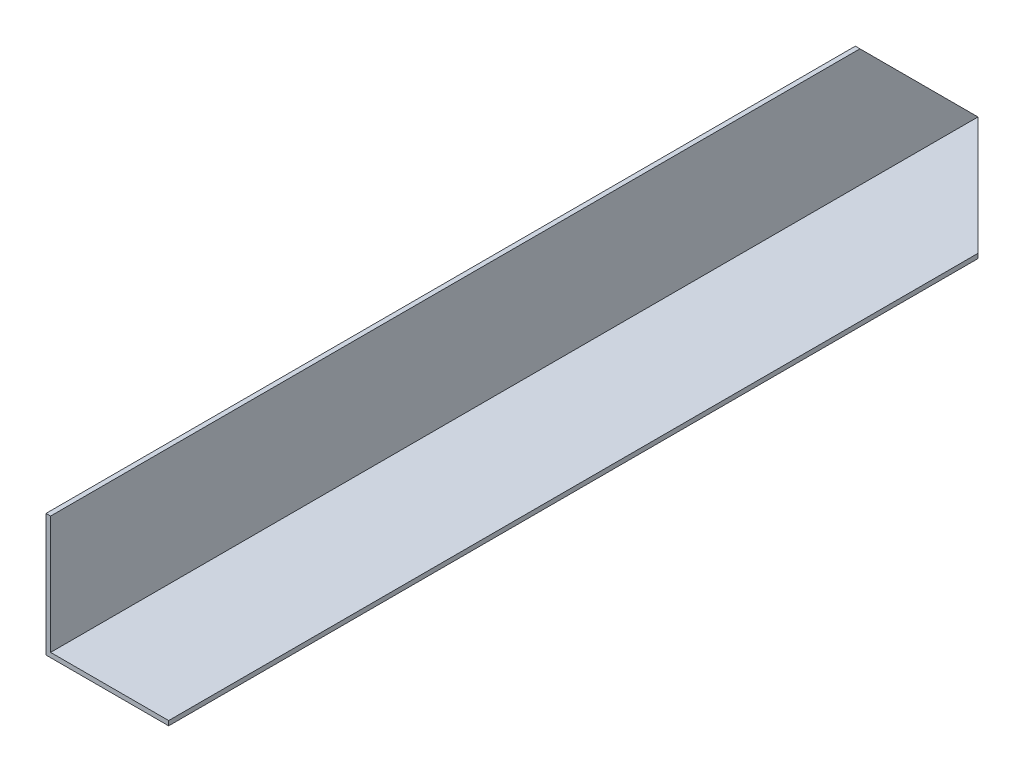
ISO-10303-21;
HEADER;
FILE_DESCRIPTION(('STEP AP214'),'2;1');
FILE_NAME('part.step','',(''),(''),'','','');
FILE_SCHEMA(('AUTOMOTIVE_DESIGN { 1 0 10303 214 1 1 1 1 }'));
ENDSEC;
DATA;
#1=APPLICATION_CONTEXT('core data for automotive mechanical design processes');
#2=APPLICATION_PROTOCOL_DEFINITION('international standard','automotive_design',2000,#1);
#3=PRODUCT_CONTEXT('',#1,'mechanical');
#4=PRODUCT('Part','Part','',(#3));
#5=PRODUCT_RELATED_PRODUCT_CATEGORY('part','',(#4));
#6=PRODUCT_DEFINITION_FORMATION('','',#4);
#7=PRODUCT_DEFINITION_CONTEXT('part definition',#1,'design');
#8=PRODUCT_DEFINITION('design','',#6,#7);
#9=PRODUCT_DEFINITION_SHAPE('','',#8);
#10=(LENGTH_UNIT() NAMED_UNIT(*) SI_UNIT(.MILLI.,.METRE.));
#11=(NAMED_UNIT(*) PLANE_ANGLE_UNIT() SI_UNIT($,.RADIAN.));
#12=(NAMED_UNIT(*) SI_UNIT($,.STERADIAN.) SOLID_ANGLE_UNIT());
#13=UNCERTAINTY_MEASURE_WITH_UNIT(LENGTH_MEASURE(1.E-05),#10,'distance_accuracy_value','');
#14=(GEOMETRIC_REPRESENTATION_CONTEXT(3) GLOBAL_UNCERTAINTY_ASSIGNED_CONTEXT((#13)) GLOBAL_UNIT_ASSIGNED_CONTEXT((#10,
#11,#12)) REPRESENTATION_CONTEXT('',''));
#15=CARTESIAN_POINT('',(0.,0.,0.));
#16=DIRECTION('',(0.,0.,1.));
#17=DIRECTION('',(1.,0.,0.));
#18=AXIS2_PLACEMENT_3D('',#15,#16,#17);
#19=CARTESIAN_POINT('',(0.,0.,300.));
#20=DIRECTION('',(0.,0.,1.));
#21=DIRECTION('',(1.,0.,0.));
#22=AXIS2_PLACEMENT_3D('',#19,#20,#21);
#23=PLANE('',#22);
#24=DIRECTION('',(0.,-1.,0.));
#25=VECTOR('',#24,1.);
#26=CARTESIAN_POINT('',(-461.5,-501.5,300.));
#27=LINE('',#26,#25);
#28=CARTESIAN_POINT('',(-461.5,-500.,300.));
#29=VERTEX_POINT('',#28);
#30=CARTESIAN_POINT('',(-461.5,-501.5,300.));
#31=VERTEX_POINT('',#30);
#32=EDGE_CURVE('E133',#29,#31,#27,.T.);
#33=ORIENTED_EDGE('',*,*,#32,.F.);
#34=DIRECTION('',(1.,0.,0.));
#35=VECTOR('',#34,1.);
#36=CARTESIAN_POINT('',(-461.5,-500.,300.));
#37=LINE('',#36,#35);
#38=CARTESIAN_POINT('',(-500.,-500.,300.));
#39=VERTEX_POINT('',#38);
#40=EDGE_CURVE('E123',#39,#29,#37,.T.);
#41=ORIENTED_EDGE('',*,*,#40,.F.);
#42=DIRECTION('',(0.,-1.,0.));
#43=VECTOR('',#42,1.);
#44=CARTESIAN_POINT('',(-500.,-500.,300.));
#45=LINE('',#44,#43);
#46=CARTESIAN_POINT('',(-500.,-461.5,300.));
#47=VERTEX_POINT('',#46);
#48=EDGE_CURVE('E125',#47,#39,#45,.T.);
#49=ORIENTED_EDGE('',*,*,#48,.F.);
#50=DIRECTION('',(1.,0.,0.));
#51=VECTOR('',#50,1.);
#52=CARTESIAN_POINT('',(-500.,-461.5,300.));
#53=LINE('',#52,#51);
#54=CARTESIAN_POINT('',(-501.5,-461.5,300.));
#55=VERTEX_POINT('',#54);
#56=EDGE_CURVE('E127',#55,#47,#53,.T.);
#57=ORIENTED_EDGE('',*,*,#56,.F.);
#58=DIRECTION('',(0.,1.,0.));
#59=VECTOR('',#58,1.);
#60=CARTESIAN_POINT('',(-501.5,-461.5,300.));
#61=LINE('',#60,#59);
#62=CARTESIAN_POINT('',(-501.5,-501.5,300.));
#63=VERTEX_POINT('',#62);
#64=EDGE_CURVE('E130',#63,#55,#61,.T.);
#65=ORIENTED_EDGE('',*,*,#64,.F.);
#66=DIRECTION('',(-1.,0.,0.));
#67=VECTOR('',#66,1.);
#68=CARTESIAN_POINT('',(-501.5,-501.5,300.));
#69=LINE('',#68,#67);
#70=EDGE_CURVE('E114',#31,#63,#69,.T.);
#71=ORIENTED_EDGE('',*,*,#70,.F.);
#72=EDGE_LOOP('',(#33,#41,#49,#57,#65,#71));
#73=FACE_BOUND('',#72,.T.);
#74=ADVANCED_FACE('F33',(#73),#23,.T.);
#75=CARTESIAN_POINT('',(-461.5,-500.,-60.5685424949238));
#76=DIRECTION('',(0.,-1.,0.));
#77=DIRECTION('',(1.,0.,0.));
#78=AXIS2_PLACEMENT_3D('',#75,#76,#77);
#79=PLANE('',#78);
#80=DIRECTION('',(0.,0.,1.));
#81=VECTOR('',#80,1.);
#82=CARTESIAN_POINT('',(-461.5,-500.,-60.5685424949238));
#83=LINE('',#82,#81);
#84=CARTESIAN_POINT('',(-461.5,-500.,36.0999999999995));
#85=VERTEX_POINT('',#84);
#86=EDGE_CURVE('E48',#85,#29,#83,.T.);
#87=ORIENTED_EDGE('',*,*,#86,.F.);
#88=DIRECTION('',(0.707106781186551,0.,0.707106781186544));
#89=VECTOR('',#88,1.);
#90=CARTESIAN_POINT('',(-501.5,-500.,-3.90000000000011));
#91=LINE('',#90,#89);
#92=CARTESIAN_POINT('',(-500.,-500.,-2.40000000000013));
#93=VERTEX_POINT('',#92);
#94=EDGE_CURVE('E135',#93,#85,#91,.T.);
#95=ORIENTED_EDGE('',*,*,#94,.F.);
#96=DIRECTION('',(0.,0.,1.));
#97=VECTOR('',#96,1.);
#98=CARTESIAN_POINT('',(-500.,-500.,-60.5685424949238));
#99=LINE('',#98,#97);
#100=EDGE_CURVE('E55',#93,#39,#99,.T.);
#101=ORIENTED_EDGE('',*,*,#100,.T.);
#102=ORIENTED_EDGE('',*,*,#40,.T.);
#103=EDGE_LOOP('',(#87,#95,#101,#102));
#104=FACE_BOUND('',#103,.T.);
#105=ADVANCED_FACE('F149',(#104),#79,.F.);
#106=CARTESIAN_POINT('',(-500.,-500.,-60.5685424949238));
#107=DIRECTION('',(-1.,0.,0.));
#108=DIRECTION('',(0.,0.,1.));
#109=AXIS2_PLACEMENT_3D('',#106,#107,#108);
#110=PLANE('',#109);
#111=ORIENTED_EDGE('',*,*,#100,.F.);
#112=DIRECTION('',(0.,-0.707106781186546,-0.707106781186549));
#113=VECTOR('',#112,1.);
#114=CARTESIAN_POINT('',(-500.,-461.5,36.1000000000001));
#115=LINE('',#114,#113);
#116=CARTESIAN_POINT('',(-500.,-461.5,36.1000000000001));
#117=VERTEX_POINT('',#116);
#118=EDGE_CURVE('E92',#117,#93,#115,.T.);
#119=ORIENTED_EDGE('',*,*,#118,.F.);
#120=DIRECTION('',(0.,0.,1.));
#121=VECTOR('',#120,1.);
#122=CARTESIAN_POINT('',(-500.,-461.5,-60.5685424949238));
#123=LINE('',#122,#121);
#124=EDGE_CURVE('E117',#117,#47,#123,.T.);
#125=ORIENTED_EDGE('',*,*,#124,.T.);
#126=ORIENTED_EDGE('',*,*,#48,.T.);
#127=EDGE_LOOP('',(#111,#119,#125,#126));
#128=FACE_BOUND('',#127,.T.);
#129=ADVANCED_FACE('F143',(#128),#110,.F.);
#130=CARTESIAN_POINT('',(-500.,-461.5,-60.5685424949238));
#131=DIRECTION('',(0.,-1.,0.));
#132=DIRECTION('',(0.,0.,-1.));
#133=AXIS2_PLACEMENT_3D('',#130,#131,#132);
#134=PLANE('',#133);
#135=ORIENTED_EDGE('',*,*,#124,.F.);
#136=DIRECTION('',(-1.,0.,0.));
#137=VECTOR('',#136,1.);
#138=CARTESIAN_POINT('',(-443.431457505076,-461.5,36.1000000000001));
#139=LINE('',#138,#137);
#140=CARTESIAN_POINT('',(-501.5,-461.5,36.1000000000001));
#141=VERTEX_POINT('',#140);
#142=EDGE_CURVE('E103',#117,#141,#139,.T.);
#143=ORIENTED_EDGE('',*,*,#142,.T.);
#144=DIRECTION('',(0.,0.,1.));
#145=VECTOR('',#144,1.);
#146=CARTESIAN_POINT('',(-501.5,-461.5,-60.5685424949238));
#147=LINE('',#146,#145);
#148=EDGE_CURVE('E102',#141,#55,#147,.T.);
#149=ORIENTED_EDGE('',*,*,#148,.T.);
#150=ORIENTED_EDGE('',*,*,#56,.T.);
#151=EDGE_LOOP('',(#135,#143,#149,#150));
#152=FACE_BOUND('',#151,.T.);
#153=ADVANCED_FACE('F141',(#152),#134,.F.);
#154=CARTESIAN_POINT('',(-501.5,-461.5,-60.5685424949238));
#155=DIRECTION('',(1.,0.,0.));
#156=DIRECTION('',(0.,0.,-1.));
#157=AXIS2_PLACEMENT_3D('',#154,#155,#156);
#158=PLANE('',#157);
#159=ORIENTED_EDGE('',*,*,#148,.F.);
#160=DIRECTION('',(0.,0.707106781186546,0.707106781186549));
#161=VECTOR('',#160,1.);
#162=CARTESIAN_POINT('',(-501.5,-461.5,36.1000000000001));
#163=LINE('',#162,#161);
#164=CARTESIAN_POINT('',(-501.5,-501.5,-3.90000000000003));
#165=VERTEX_POINT('',#164);
#166=EDGE_CURVE('E89',#165,#141,#163,.T.);
#167=ORIENTED_EDGE('',*,*,#166,.F.);
#168=DIRECTION('',(0.,0.,1.));
#169=VECTOR('',#168,1.);
#170=CARTESIAN_POINT('',(-501.5,-501.5,-60.5685424949238));
#171=LINE('',#170,#169);
#172=EDGE_CURVE('E100',#165,#63,#171,.T.);
#173=ORIENTED_EDGE('',*,*,#172,.T.);
#174=ORIENTED_EDGE('',*,*,#64,.T.);
#175=EDGE_LOOP('',(#159,#167,#173,#174));
#176=FACE_BOUND('',#175,.T.);
#177=ADVANCED_FACE('F97',(#176),#158,.F.);
#178=CARTESIAN_POINT('',(-501.5,-501.5,-60.5685424949238));
#179=DIRECTION('',(0.,1.,0.));
#180=DIRECTION('',(0.,0.,1.));
#181=AXIS2_PLACEMENT_3D('',#178,#179,#180);
#182=PLANE('',#181);
#183=ORIENTED_EDGE('',*,*,#172,.F.);
#184=DIRECTION('',(-0.707106781186551,0.,-0.707106781186544));
#185=VECTOR('',#184,1.);
#186=CARTESIAN_POINT('',(-501.5,-501.5,-3.90000000000003));
#187=LINE('',#186,#185);
#188=CARTESIAN_POINT('',(-461.5,-501.5,36.0999999999995));
#189=VERTEX_POINT('',#188);
#190=EDGE_CURVE('E106',#189,#165,#187,.T.);
#191=ORIENTED_EDGE('',*,*,#190,.F.);
#192=DIRECTION('',(0.,0.,1.));
#193=VECTOR('',#192,1.);
#194=CARTESIAN_POINT('',(-461.5,-501.5,-60.5685424949238));
#195=LINE('',#194,#193);
#196=EDGE_CURVE('E41',#189,#31,#195,.T.);
#197=ORIENTED_EDGE('',*,*,#196,.T.);
#198=ORIENTED_EDGE('',*,*,#70,.T.);
#199=EDGE_LOOP('',(#183,#191,#197,#198));
#200=FACE_BOUND('',#199,.T.);
#201=ADVANCED_FACE('F112',(#200),#182,.F.);
#202=CARTESIAN_POINT('',(-461.5,-501.5,-60.5685424949238));
#203=DIRECTION('',(-1.,0.,0.));
#204=DIRECTION('',(0.,0.,1.));
#205=AXIS2_PLACEMENT_3D('',#202,#203,#204);
#206=PLANE('',#205);
#207=ORIENTED_EDGE('',*,*,#196,.F.);
#208=DIRECTION('',(0.,-1.,0.));
#209=VECTOR('',#208,1.);
#210=CARTESIAN_POINT('',(-461.5,-443.431457505077,36.0999999999995));
#211=LINE('',#210,#209);
#212=EDGE_CURVE('E108',#85,#189,#211,.T.);
#213=ORIENTED_EDGE('',*,*,#212,.F.);
#214=ORIENTED_EDGE('',*,*,#86,.T.);
#215=ORIENTED_EDGE('',*,*,#32,.T.);
#216=EDGE_LOOP('',(#207,#213,#214,#215));
#217=FACE_BOUND('',#216,.T.);
#218=ADVANCED_FACE('F35',(#217),#206,.F.);
#219=CARTESIAN_POINT('',(-501.5,-443.431457505077,-3.90000000000003));
#220=DIRECTION('',(-0.707106781186544,0.,0.707106781186551));
#221=DIRECTION('',(0.707106781186551,0.,0.707106781186544));
#222=AXIS2_PLACEMENT_3D('',#219,#220,#221);
#223=PLANE('',#222);
#224=ORIENTED_EDGE('',*,*,#190,.T.);
#225=DIRECTION('',(0.57735026918963,0.577350269189623,0.577350269189624));
#226=VECTOR('',#225,1.);
#227=CARTESIAN_POINT('',(-482.143819168359,-482.143819168359,15.456180831641));
#228=LINE('',#227,#226);
#229=EDGE_CURVE('E11',#165,#93,#228,.T.);
#230=ORIENTED_EDGE('',*,*,#229,.T.);
#231=ORIENTED_EDGE('',*,*,#94,.T.);
#232=ORIENTED_EDGE('',*,*,#212,.T.);
#233=EDGE_LOOP('',(#224,#230,#231,#232));
#234=FACE_BOUND('',#233,.T.);
#235=ADVANCED_FACE('F107',(#234),#223,.F.);
#236=CARTESIAN_POINT('',(-443.431457505076,-461.5,36.1000000000001));
#237=DIRECTION('',(0.,-0.707106781186549,0.707106781186546));
#238=DIRECTION('',(0.,-0.707106781186546,-0.707106781186549));
#239=AXIS2_PLACEMENT_3D('',#236,#237,#238);
#240=PLANE('',#239);
#241=ORIENTED_EDGE('',*,*,#166,.T.);
#242=ORIENTED_EDGE('',*,*,#142,.F.);
#243=ORIENTED_EDGE('',*,*,#118,.T.);
#244=ORIENTED_EDGE('',*,*,#229,.F.);
#245=EDGE_LOOP('',(#241,#242,#243,#244));
#246=FACE_BOUND('',#245,.T.);
#247=ADVANCED_FACE('F88',(#246),#240,.F.);
#248=CLOSED_SHELL('',(#74,#105,#129,#153,#177,#201,#218,#235,#247));
#249=MANIFOLD_SOLID_BREP('B2',#248);
#250=ADVANCED_BREP_SHAPE_REPRESENTATION('',(#18,#249),#14);
#251=SHAPE_DEFINITION_REPRESENTATION(#9,#250);
ENDSEC;
END-ISO-10303-21;
